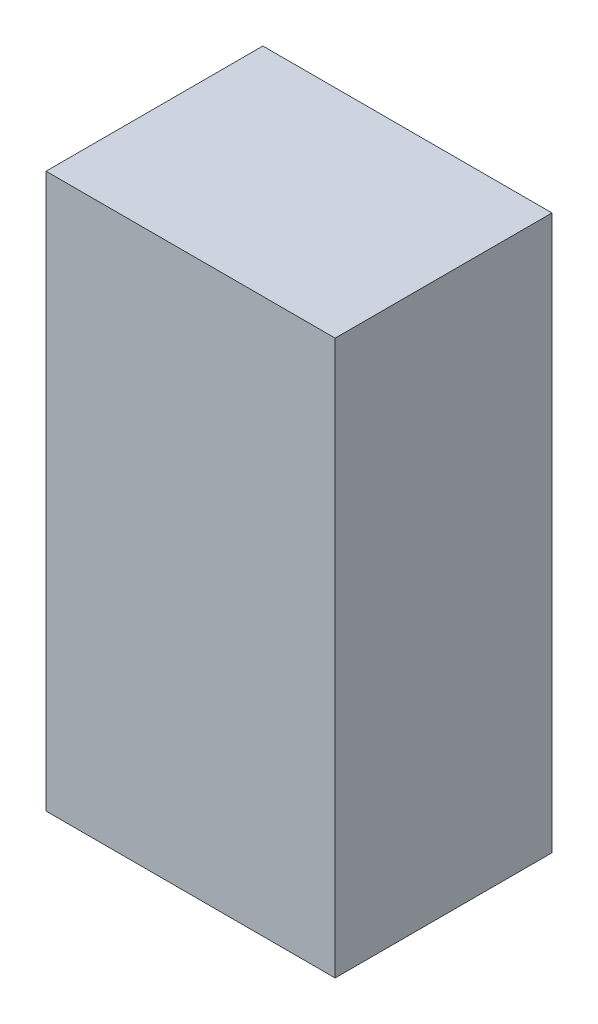
ISO-10303-21;
HEADER;
FILE_DESCRIPTION(('STEP AP214'),'2;1');
FILE_NAME('part.step','',(''),(''),'','','');
FILE_SCHEMA(('AUTOMOTIVE_DESIGN { 1 0 10303 214 1 1 1 1 }'));
ENDSEC;
DATA;
#1=APPLICATION_CONTEXT('core data for automotive mechanical design processes');
#2=APPLICATION_PROTOCOL_DEFINITION('international standard','automotive_design',2000,#1);
#3=PRODUCT_CONTEXT('',#1,'mechanical');
#4=PRODUCT('Part','Part','',(#3));
#5=PRODUCT_RELATED_PRODUCT_CATEGORY('part','',(#4));
#6=PRODUCT_DEFINITION_FORMATION('','',#4);
#7=PRODUCT_DEFINITION_CONTEXT('part definition',#1,'design');
#8=PRODUCT_DEFINITION('design','',#6,#7);
#9=PRODUCT_DEFINITION_SHAPE('','',#8);
#10=(LENGTH_UNIT() NAMED_UNIT(*) SI_UNIT(.MILLI.,.METRE.));
#11=(NAMED_UNIT(*) PLANE_ANGLE_UNIT() SI_UNIT($,.RADIAN.));
#12=(NAMED_UNIT(*) SI_UNIT($,.STERADIAN.) SOLID_ANGLE_UNIT());
#13=UNCERTAINTY_MEASURE_WITH_UNIT(LENGTH_MEASURE(1.E-05),#10,'distance_accuracy_value','');
#14=(GEOMETRIC_REPRESENTATION_CONTEXT(3) GLOBAL_UNCERTAINTY_ASSIGNED_CONTEXT((#13)) GLOBAL_UNIT_ASSIGNED_CONTEXT((#10,
#11,#12)) REPRESENTATION_CONTEXT('',''));
#15=CARTESIAN_POINT('',(0.,0.,0.));
#16=DIRECTION('',(0.,0.,1.));
#17=DIRECTION('',(1.,0.,0.));
#18=AXIS2_PLACEMENT_3D('',#15,#16,#17);
#19=CARTESIAN_POINT('',(30.,57.5,45.));
#20=DIRECTION('',(-1.,0.,0.));
#21=DIRECTION('',(0.,-1.,0.));
#22=AXIS2_PLACEMENT_3D('',#19,#20,#21);
#23=PLANE('',#22);
#24=DIRECTION('',(0.,1.,0.));
#25=VECTOR('',#24,1.);
#26=CARTESIAN_POINT('',(30.,57.5,0.));
#27=LINE('',#26,#25);
#28=CARTESIAN_POINT('',(30.,-57.5,0.));
#29=VERTEX_POINT('',#28);
#30=CARTESIAN_POINT('',(30.,57.5,0.));
#31=VERTEX_POINT('',#30);
#32=EDGE_CURVE('E96',#29,#31,#27,.T.);
#33=ORIENTED_EDGE('',*,*,#32,.T.);
#34=DIRECTION('',(0.,0.,-1.));
#35=VECTOR('',#34,1.);
#36=CARTESIAN_POINT('',(30.,57.5,45.));
#37=LINE('',#36,#35);
#38=CARTESIAN_POINT('',(30.,57.5,45.));
#39=VERTEX_POINT('',#38);
#40=EDGE_CURVE('E11',#39,#31,#37,.T.);
#41=ORIENTED_EDGE('',*,*,#40,.F.);
#42=DIRECTION('',(0.,1.,0.));
#43=VECTOR('',#42,1.);
#44=CARTESIAN_POINT('',(30.,57.5,45.));
#45=LINE('',#44,#43);
#46=CARTESIAN_POINT('',(30.,-57.5,45.));
#47=VERTEX_POINT('',#46);
#48=EDGE_CURVE('E84',#47,#39,#45,.T.);
#49=ORIENTED_EDGE('',*,*,#48,.F.);
#50=DIRECTION('',(0.,0.,-1.));
#51=VECTOR('',#50,1.);
#52=CARTESIAN_POINT('',(30.,-57.5,45.));
#53=LINE('',#52,#51);
#54=EDGE_CURVE('E92',#47,#29,#53,.T.);
#55=ORIENTED_EDGE('',*,*,#54,.T.);
#56=EDGE_LOOP('',(#33,#41,#49,#55));
#57=FACE_BOUND('',#56,.T.);
#58=ADVANCED_FACE('F33',(#57),#23,.F.);
#59=CARTESIAN_POINT('',(-30.,57.5,45.));
#60=DIRECTION('',(0.,-1.,0.));
#61=DIRECTION('',(0.,0.,-1.));
#62=AXIS2_PLACEMENT_3D('',#59,#60,#61);
#63=PLANE('',#62);
#64=DIRECTION('',(-1.,0.,0.));
#65=VECTOR('',#64,1.);
#66=CARTESIAN_POINT('',(-30.,57.5,0.));
#67=LINE('',#66,#65);
#68=CARTESIAN_POINT('',(-30.,57.5,0.));
#69=VERTEX_POINT('',#68);
#70=EDGE_CURVE('E88',#31,#69,#67,.T.);
#71=ORIENTED_EDGE('',*,*,#70,.T.);
#72=DIRECTION('',(0.,0.,-1.));
#73=VECTOR('',#72,1.);
#74=CARTESIAN_POINT('',(-30.,57.5,45.));
#75=LINE('',#74,#73);
#76=CARTESIAN_POINT('',(-30.,57.5,45.));
#77=VERTEX_POINT('',#76);
#78=EDGE_CURVE('E41',#77,#69,#75,.T.);
#79=ORIENTED_EDGE('',*,*,#78,.F.);
#80=DIRECTION('',(-1.,0.,0.));
#81=VECTOR('',#80,1.);
#82=CARTESIAN_POINT('',(-30.,57.5,45.));
#83=LINE('',#82,#81);
#84=EDGE_CURVE('E79',#39,#77,#83,.T.);
#85=ORIENTED_EDGE('',*,*,#84,.F.);
#86=ORIENTED_EDGE('',*,*,#40,.T.);
#87=EDGE_LOOP('',(#71,#79,#85,#86));
#88=FACE_BOUND('',#87,.T.);
#89=ADVANCED_FACE('F87',(#88),#63,.F.);
#90=CARTESIAN_POINT('',(-30.,57.5,45.));
#91=DIRECTION('',(1.,0.,0.));
#92=DIRECTION('',(0.,1.,0.));
#93=AXIS2_PLACEMENT_3D('',#90,#91,#92);
#94=PLANE('',#93);
#95=DIRECTION('',(0.,-1.,0.));
#96=VECTOR('',#95,1.);
#97=CARTESIAN_POINT('',(-30.,57.5,0.));
#98=LINE('',#97,#96);
#99=CARTESIAN_POINT('',(-30.,-57.5,0.));
#100=VERTEX_POINT('',#99);
#101=EDGE_CURVE('E66',#69,#100,#98,.T.);
#102=ORIENTED_EDGE('',*,*,#101,.T.);
#103=DIRECTION('',(0.,0.,-1.));
#104=VECTOR('',#103,1.);
#105=CARTESIAN_POINT('',(-30.,-57.5,45.));
#106=LINE('',#105,#104);
#107=CARTESIAN_POINT('',(-30.,-57.5,45.));
#108=VERTEX_POINT('',#107);
#109=EDGE_CURVE('E89',#108,#100,#106,.T.);
#110=ORIENTED_EDGE('',*,*,#109,.F.);
#111=DIRECTION('',(0.,-1.,0.));
#112=VECTOR('',#111,1.);
#113=CARTESIAN_POINT('',(-30.,57.5,45.));
#114=LINE('',#113,#112);
#115=EDGE_CURVE('E82',#77,#108,#114,.T.);
#116=ORIENTED_EDGE('',*,*,#115,.F.);
#117=ORIENTED_EDGE('',*,*,#78,.T.);
#118=EDGE_LOOP('',(#102,#110,#116,#117));
#119=FACE_BOUND('',#118,.T.);
#120=ADVANCED_FACE('F90',(#119),#94,.F.);
#121=CARTESIAN_POINT('',(-30.,-57.5,45.));
#122=DIRECTION('',(0.,1.,0.));
#123=DIRECTION('',(0.,0.,1.));
#124=AXIS2_PLACEMENT_3D('',#121,#122,#123);
#125=PLANE('',#124);
#126=DIRECTION('',(1.,0.,0.));
#127=VECTOR('',#126,1.);
#128=CARTESIAN_POINT('',(-30.,-57.5,0.));
#129=LINE('',#128,#127);
#130=EDGE_CURVE('E72',#100,#29,#129,.T.);
#131=ORIENTED_EDGE('',*,*,#130,.T.);
#132=ORIENTED_EDGE('',*,*,#54,.F.);
#133=DIRECTION('',(1.,0.,0.));
#134=VECTOR('',#133,1.);
#135=CARTESIAN_POINT('',(-30.,-57.5,45.));
#136=LINE('',#135,#134);
#137=EDGE_CURVE('E49',#108,#47,#136,.T.);
#138=ORIENTED_EDGE('',*,*,#137,.F.);
#139=ORIENTED_EDGE('',*,*,#109,.T.);
#140=EDGE_LOOP('',(#131,#132,#138,#139));
#141=FACE_BOUND('',#140,.T.);
#142=ADVANCED_FACE('F103',(#141),#125,.F.);
#143=CARTESIAN_POINT('',(0.,0.,45.));
#144=DIRECTION('',(0.,0.,1.));
#145=DIRECTION('',(1.,0.,0.));
#146=AXIS2_PLACEMENT_3D('',#143,#144,#145);
#147=PLANE('',#146);
#148=ORIENTED_EDGE('',*,*,#48,.T.);
#149=ORIENTED_EDGE('',*,*,#84,.T.);
#150=ORIENTED_EDGE('',*,*,#115,.T.);
#151=ORIENTED_EDGE('',*,*,#137,.T.);
#152=EDGE_LOOP('',(#148,#149,#150,#151));
#153=FACE_BOUND('',#152,.T.);
#154=ADVANCED_FACE('F80',(#153),#147,.T.);
#155=CARTESIAN_POINT('',(0.,0.,0.));
#156=DIRECTION('',(0.,0.,1.));
#157=DIRECTION('',(1.,0.,0.));
#158=AXIS2_PLACEMENT_3D('',#155,#156,#157);
#159=PLANE('',#158);
#160=ORIENTED_EDGE('',*,*,#32,.F.);
#161=ORIENTED_EDGE('',*,*,#130,.F.);
#162=ORIENTED_EDGE('',*,*,#101,.F.);
#163=ORIENTED_EDGE('',*,*,#70,.F.);
#164=EDGE_LOOP('',(#160,#161,#162,#163));
#165=FACE_BOUND('',#164,.T.);
#166=ADVANCED_FACE('F106',(#165),#159,.F.);
#167=CLOSED_SHELL('',(#58,#89,#120,#142,#154,#166));
#168=MANIFOLD_SOLID_BREP('B2',#167);
#169=ADVANCED_BREP_SHAPE_REPRESENTATION('',(#18,#168),#14);
#170=SHAPE_DEFINITION_REPRESENTATION(#9,#169);
ENDSEC;
END-ISO-10303-21;
